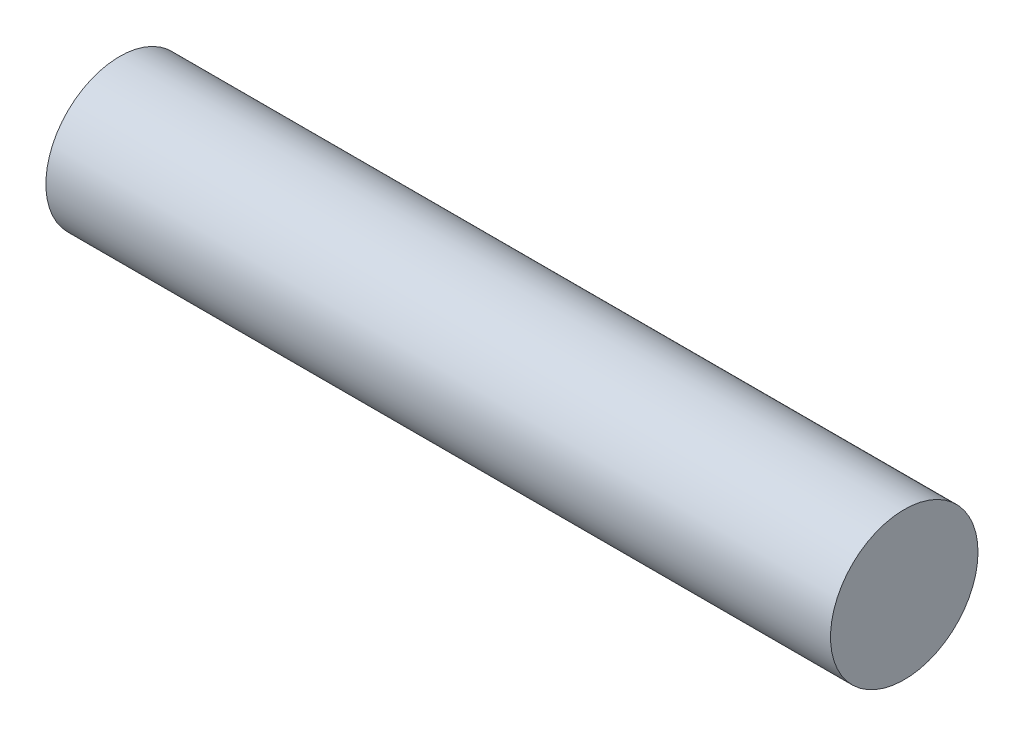
ISO-10303-21;
HEADER;
FILE_DESCRIPTION(('STEP AP214'),'2;1');
FILE_NAME('part.step','',(''),(''),'','','');
FILE_SCHEMA(('AUTOMOTIVE_DESIGN { 1 0 10303 214 1 1 1 1 }'));
ENDSEC;
DATA;
#1=APPLICATION_CONTEXT('core data for automotive mechanical design processes');
#2=APPLICATION_PROTOCOL_DEFINITION('international standard','automotive_design',2000,#1);
#3=PRODUCT_CONTEXT('',#1,'mechanical');
#4=PRODUCT('Part','Part','',(#3));
#5=PRODUCT_RELATED_PRODUCT_CATEGORY('part','',(#4));
#6=PRODUCT_DEFINITION_FORMATION('','',#4);
#7=PRODUCT_DEFINITION_CONTEXT('part definition',#1,'design');
#8=PRODUCT_DEFINITION('design','',#6,#7);
#9=PRODUCT_DEFINITION_SHAPE('','',#8);
#10=(LENGTH_UNIT() NAMED_UNIT(*) SI_UNIT(.MILLI.,.METRE.));
#11=(NAMED_UNIT(*) PLANE_ANGLE_UNIT() SI_UNIT($,.RADIAN.));
#12=(NAMED_UNIT(*) SI_UNIT($,.STERADIAN.) SOLID_ANGLE_UNIT());
#13=UNCERTAINTY_MEASURE_WITH_UNIT(LENGTH_MEASURE(1.E-05),#10,'distance_accuracy_value','');
#14=(GEOMETRIC_REPRESENTATION_CONTEXT(3) GLOBAL_UNCERTAINTY_ASSIGNED_CONTEXT((#13)) GLOBAL_UNIT_ASSIGNED_CONTEXT((#10,
#11,#12)) REPRESENTATION_CONTEXT('',''));
#15=CARTESIAN_POINT('',(0.,0.,0.));
#16=DIRECTION('',(0.,0.,1.));
#17=DIRECTION('',(1.,0.,0.));
#18=AXIS2_PLACEMENT_3D('',#15,#16,#17);
#19=CARTESIAN_POINT('',(26.6,0.,0.));
#20=DIRECTION('',(-1.,0.,0.));
#21=DIRECTION('',(0.,0.,1.));
#22=AXIS2_PLACEMENT_3D('',#19,#20,#21);
#23=CYLINDRICAL_SURFACE('',#22,2.5);
#24=CARTESIAN_POINT('',(26.6,0.,0.));
#25=DIRECTION('',(1.,0.,0.));
#26=DIRECTION('',(0.,0.,-1.));
#27=AXIS2_PLACEMENT_3D('',#24,#25,#26);
#28=CIRCLE('',#27,2.5);
#29=CARTESIAN_POINT('',(26.6,0.,-2.5));
#30=VERTEX_POINT('',#29);
#31=EDGE_CURVE('E10',#30,#30,#28,.T.);
#32=ORIENTED_EDGE('',*,*,#31,.F.);
#33=EDGE_LOOP('',(#32));
#34=FACE_BOUND('',#33,.T.);
#35=CARTESIAN_POINT('',(0.,0.,0.));
#36=DIRECTION('',(1.,0.,0.));
#37=DIRECTION('',(0.,0.,-1.));
#38=AXIS2_PLACEMENT_3D('',#35,#36,#37);
#39=CIRCLE('',#38,2.5);
#40=CARTESIAN_POINT('',(0.,0.,-2.5));
#41=VERTEX_POINT('',#40);
#42=EDGE_CURVE('E42',#41,#41,#39,.T.);
#43=ORIENTED_EDGE('',*,*,#42,.T.);
#44=EDGE_LOOP('',(#43));
#45=FACE_BOUND('',#44,.T.);
#46=ADVANCED_FACE('F39',(#34,#45),#23,.T.);
#47=CARTESIAN_POINT('',(26.6,0.,0.));
#48=DIRECTION('',(1.,0.,0.));
#49=DIRECTION('',(0.,0.,-1.));
#50=AXIS2_PLACEMENT_3D('',#47,#48,#49);
#51=PLANE('',#50);
#52=ORIENTED_EDGE('',*,*,#31,.T.);
#53=EDGE_LOOP('',(#52));
#54=FACE_BOUND('',#53,.T.);
#55=ADVANCED_FACE('F54',(#54),#51,.T.);
#56=CARTESIAN_POINT('',(0.,0.,0.));
#57=DIRECTION('',(1.,0.,0.));
#58=DIRECTION('',(0.,0.,-1.));
#59=AXIS2_PLACEMENT_3D('',#56,#57,#58);
#60=PLANE('',#59);
#61=ORIENTED_EDGE('',*,*,#42,.F.);
#62=EDGE_LOOP('',(#61));
#63=FACE_BOUND('',#62,.T.);
#64=ADVANCED_FACE('F52',(#63),#60,.F.);
#65=CLOSED_SHELL('',(#46,#55,#64));
#66=MANIFOLD_SOLID_BREP('B2',#65);
#67=ADVANCED_BREP_SHAPE_REPRESENTATION('',(#18,#66),#14);
#68=SHAPE_DEFINITION_REPRESENTATION(#9,#67);
ENDSEC;
END-ISO-10303-21;
